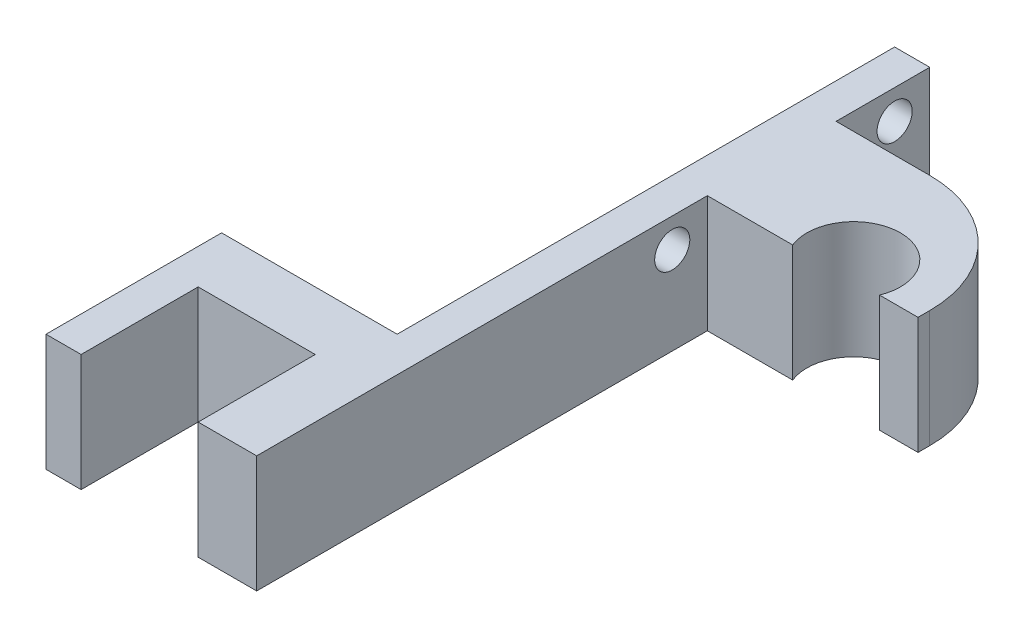
ISO-10303-21;
HEADER;
FILE_DESCRIPTION(('STEP AP214'),'2;1');
FILE_NAME('part.step','',(''),(''),'','','');
FILE_SCHEMA(('AUTOMOTIVE_DESIGN { 1 0 10303 214 1 1 1 1 }'));
ENDSEC;
DATA;
#1=APPLICATION_CONTEXT('core data for automotive mechanical design processes');
#2=APPLICATION_PROTOCOL_DEFINITION('international standard','automotive_design',2000,#1);
#3=PRODUCT_CONTEXT('',#1,'mechanical');
#4=PRODUCT('Part','Part','',(#3));
#5=PRODUCT_RELATED_PRODUCT_CATEGORY('part','',(#4));
#6=PRODUCT_DEFINITION_FORMATION('','',#4);
#7=PRODUCT_DEFINITION_CONTEXT('part definition',#1,'design');
#8=PRODUCT_DEFINITION('design','',#6,#7);
#9=PRODUCT_DEFINITION_SHAPE('','',#8);
#10=(LENGTH_UNIT() NAMED_UNIT(*) SI_UNIT(.MILLI.,.METRE.));
#11=(NAMED_UNIT(*) PLANE_ANGLE_UNIT() SI_UNIT($,.RADIAN.));
#12=(NAMED_UNIT(*) SI_UNIT($,.STERADIAN.) SOLID_ANGLE_UNIT());
#13=UNCERTAINTY_MEASURE_WITH_UNIT(LENGTH_MEASURE(1.E-05),#10,'distance_accuracy_value','');
#14=(GEOMETRIC_REPRESENTATION_CONTEXT(3) GLOBAL_UNCERTAINTY_ASSIGNED_CONTEXT((#13)) GLOBAL_UNIT_ASSIGNED_CONTEXT((#10,
#11,#12)) REPRESENTATION_CONTEXT('',''));
#15=CARTESIAN_POINT('',(0.,0.,0.));
#16=DIRECTION('',(0.,0.,1.));
#17=DIRECTION('',(1.,0.,0.));
#18=AXIS2_PLACEMENT_3D('',#15,#16,#17);
#19=CARTESIAN_POINT('',(5.,10.,-42.5));
#20=DIRECTION('',(0.,0.,1.));
#21=DIRECTION('',(1.,0.,0.));
#22=AXIS2_PLACEMENT_3D('',#19,#20,#21);
#23=PLANE('',#22);
#24=DIRECTION('',(0.,-1.,0.));
#25=VECTOR('',#24,1.);
#26=CARTESIAN_POINT('',(2.,10.,-42.5));
#27=LINE('',#26,#25);
#28=CARTESIAN_POINT('',(2.,10.,-42.5));
#29=VERTEX_POINT('',#28);
#30=CARTESIAN_POINT('',(2.,0.,-42.5));
#31=VERTEX_POINT('',#30);
#32=EDGE_CURVE('E178',#29,#31,#27,.T.);
#33=ORIENTED_EDGE('',*,*,#32,.F.);
#34=DIRECTION('',(-1.,0.,0.));
#35=VECTOR('',#34,1.);
#36=CARTESIAN_POINT('',(5.,10.,-42.5));
#37=LINE('',#36,#35);
#38=CARTESIAN_POINT('',(5.,10.,-42.5));
#39=VERTEX_POINT('',#38);
#40=EDGE_CURVE('E229',#39,#29,#37,.T.);
#41=ORIENTED_EDGE('',*,*,#40,.F.);
#42=DIRECTION('',(0.,-1.,0.));
#43=VECTOR('',#42,1.);
#44=CARTESIAN_POINT('',(5.,10.,-42.5));
#45=LINE('',#44,#43);
#46=CARTESIAN_POINT('',(5.,0.,-42.5));
#47=VERTEX_POINT('',#46);
#48=EDGE_CURVE('E231',#39,#47,#45,.T.);
#49=ORIENTED_EDGE('',*,*,#48,.T.);
#50=DIRECTION('',(-1.,0.,0.));
#51=VECTOR('',#50,1.);
#52=CARTESIAN_POINT('',(5.,0.,-42.5));
#53=LINE('',#52,#51);
#54=EDGE_CURVE('E205',#47,#31,#53,.T.);
#55=ORIENTED_EDGE('',*,*,#54,.T.);
#56=EDGE_LOOP('',(#33,#41,#49,#55));
#57=FACE_BOUND('',#56,.T.);
#58=ADVANCED_FACE('F34',(#57),#23,.F.);
#59=CARTESIAN_POINT('',(23.,7.5,-39.5));
#60=DIRECTION('',(-1.,0.,0.));
#61=DIRECTION('',(0.,0.,1.));
#62=AXIS2_PLACEMENT_3D('',#59,#60,#61);
#63=CYLINDRICAL_SURFACE('',#62,1.5);
#64=CARTESIAN_POINT('',(5.,7.5,-39.5));
#65=DIRECTION('',(-1.,0.,0.));
#66=DIRECTION('',(0.,0.,1.));
#67=AXIS2_PLACEMENT_3D('',#64,#65,#66);
#68=CIRCLE('',#67,1.5);
#69=CARTESIAN_POINT('',(5.,7.5,-38.));
#70=VERTEX_POINT('',#69);
#71=EDGE_CURVE('E190',#70,#70,#68,.T.);
#72=ORIENTED_EDGE('',*,*,#71,.F.);
#73=EDGE_LOOP('',(#72));
#74=FACE_BOUND('',#73,.T.);
#75=CARTESIAN_POINT('',(2.,7.5,-39.5));
#76=DIRECTION('',(-1.,0.,0.));
#77=DIRECTION('',(0.,0.,1.));
#78=AXIS2_PLACEMENT_3D('',#75,#76,#77);
#79=CIRCLE('',#78,1.5);
#80=CARTESIAN_POINT('',(2.,7.5,-38.));
#81=VERTEX_POINT('',#80);
#82=EDGE_CURVE('E184',#81,#81,#79,.F.);
#83=ORIENTED_EDGE('',*,*,#82,.F.);
#84=EDGE_LOOP('',(#83));
#85=FACE_BOUND('',#84,.T.);
#86=ADVANCED_FACE('F316',(#74,#85),#63,.F.);
#87=CARTESIAN_POINT('',(23.,7.5,-20.5));
#88=DIRECTION('',(-1.,0.,0.));
#89=DIRECTION('',(0.,0.,1.));
#90=AXIS2_PLACEMENT_3D('',#87,#88,#89);
#91=CYLINDRICAL_SURFACE('',#90,1.5);
#92=CARTESIAN_POINT('',(5.,7.5,-20.5));
#93=DIRECTION('',(-1.,0.,0.));
#94=DIRECTION('',(0.,0.,1.));
#95=AXIS2_PLACEMENT_3D('',#92,#93,#94);
#96=CIRCLE('',#95,1.5);
#97=CARTESIAN_POINT('',(5.,7.5,-19.));
#98=VERTEX_POINT('',#97);
#99=EDGE_CURVE('E187',#98,#98,#96,.T.);
#100=ORIENTED_EDGE('',*,*,#99,.F.);
#101=EDGE_LOOP('',(#100));
#102=FACE_BOUND('',#101,.T.);
#103=CARTESIAN_POINT('',(2.,7.5,-20.5));
#104=DIRECTION('',(-1.,0.,0.));
#105=DIRECTION('',(0.,0.,1.));
#106=AXIS2_PLACEMENT_3D('',#103,#104,#105);
#107=CIRCLE('',#106,1.5);
#108=CARTESIAN_POINT('',(2.,7.5,-19.));
#109=VERTEX_POINT('',#108);
#110=EDGE_CURVE('E183',#109,#109,#107,.F.);
#111=ORIENTED_EDGE('',*,*,#110,.F.);
#112=EDGE_LOOP('',(#111));
#113=FACE_BOUND('',#112,.T.);
#114=ADVANCED_FACE('F321',(#102,#113),#91,.F.);
#115=CARTESIAN_POINT('',(23.,10.,-23.5));
#116=DIRECTION('',(0.,0.,-1.));
#117=DIRECTION('',(-1.,0.,0.));
#118=AXIS2_PLACEMENT_3D('',#115,#116,#117);
#119=PLANE('',#118);
#120=DIRECTION('',(1.,0.,0.));
#121=VECTOR('',#120,1.);
#122=CARTESIAN_POINT('',(23.,0.,-23.5));
#123=LINE('',#122,#121);
#124=CARTESIAN_POINT('',(5.,0.,-23.5));
#125=VERTEX_POINT('',#124);
#126=CARTESIAN_POINT('',(12.2919007564522,0.,-23.5));
#127=VERTEX_POINT('',#126);
#128=EDGE_CURVE('E247',#125,#127,#123,.T.);
#129=ORIENTED_EDGE('',*,*,#128,.T.);
#130=DIRECTION('',(0.,1.,0.));
#131=VECTOR('',#130,1.);
#132=CARTESIAN_POINT('',(12.2919007564522,0.,-23.5));
#133=LINE('',#132,#131);
#134=CARTESIAN_POINT('',(12.2919007564522,10.,-23.5));
#135=VERTEX_POINT('',#134);
#136=EDGE_CURVE('E164',#127,#135,#133,.T.);
#137=ORIENTED_EDGE('',*,*,#136,.T.);
#138=DIRECTION('',(1.,0.,0.));
#139=VECTOR('',#138,1.);
#140=CARTESIAN_POINT('',(23.,10.,-23.5));
#141=LINE('',#140,#139);
#142=CARTESIAN_POINT('',(5.,10.,-23.5));
#143=VERTEX_POINT('',#142);
#144=EDGE_CURVE('E220',#143,#135,#141,.T.);
#145=ORIENTED_EDGE('',*,*,#144,.F.);
#146=DIRECTION('',(0.,-1.,0.));
#147=VECTOR('',#146,1.);
#148=CARTESIAN_POINT('',(5.,10.,-23.5));
#149=LINE('',#148,#147);
#150=EDGE_CURVE('E265',#143,#125,#149,.T.);
#151=ORIENTED_EDGE('',*,*,#150,.T.);
#152=EDGE_LOOP('',(#129,#137,#145,#151));
#153=FACE_BOUND('',#152,.T.);
#154=ADVANCED_FACE('F340',(#153),#119,.F.);
#155=CARTESIAN_POINT('',(-13.,10.,0.));
#156=DIRECTION('',(0.,0.,1.));
#157=DIRECTION('',(1.,0.,0.));
#158=AXIS2_PLACEMENT_3D('',#155,#156,#157);
#159=PLANE('',#158);
#160=DIRECTION('',(-1.,0.,0.));
#161=VECTOR('',#160,1.);
#162=CARTESIAN_POINT('',(-13.,0.,0.));
#163=LINE('',#162,#161);
#164=CARTESIAN_POINT('',(2.,0.,0.));
#165=VERTEX_POINT('',#164);
#166=CARTESIAN_POINT('',(-13.,0.,0.));
#167=VERTEX_POINT('',#166);
#168=EDGE_CURVE('E152',#165,#167,#163,.T.);
#169=ORIENTED_EDGE('',*,*,#168,.T.);
#170=DIRECTION('',(0.,-1.,0.));
#171=VECTOR('',#170,1.);
#172=CARTESIAN_POINT('',(-13.,10.,0.));
#173=LINE('',#172,#171);
#174=CARTESIAN_POINT('',(-13.,10.,0.));
#175=VERTEX_POINT('',#174);
#176=EDGE_CURVE('E286',#175,#167,#173,.T.);
#177=ORIENTED_EDGE('',*,*,#176,.F.);
#178=DIRECTION('',(-1.,0.,0.));
#179=VECTOR('',#178,1.);
#180=CARTESIAN_POINT('',(-13.,10.,0.));
#181=LINE('',#180,#179);
#182=CARTESIAN_POINT('',(2.,10.,0.));
#183=VERTEX_POINT('',#182);
#184=EDGE_CURVE('E170',#183,#175,#181,.T.);
#185=ORIENTED_EDGE('',*,*,#184,.F.);
#186=DIRECTION('',(0.,1.,0.));
#187=VECTOR('',#186,1.);
#188=CARTESIAN_POINT('',(2.,10.,0.));
#189=LINE('',#188,#187);
#190=EDGE_CURVE('E167',#165,#183,#189,.T.);
#191=ORIENTED_EDGE('',*,*,#190,.F.);
#192=EDGE_LOOP('',(#169,#177,#185,#191));
#193=FACE_BOUND('',#192,.T.);
#194=ADVANCED_FACE('F168',(#193),#159,.F.);
#195=CARTESIAN_POINT('',(-13.,10.,15.));
#196=DIRECTION('',(1.,0.,0.));
#197=DIRECTION('',(0.,0.,-1.));
#198=AXIS2_PLACEMENT_3D('',#195,#196,#197);
#199=PLANE('',#198);
#200=DIRECTION('',(0.,0.,1.));
#201=VECTOR('',#200,1.);
#202=CARTESIAN_POINT('',(-13.,0.,15.));
#203=LINE('',#202,#201);
#204=CARTESIAN_POINT('',(-13.,0.,15.));
#205=VERTEX_POINT('',#204);
#206=EDGE_CURVE('E160',#167,#205,#203,.T.);
#207=ORIENTED_EDGE('',*,*,#206,.T.);
#208=DIRECTION('',(0.,-1.,0.));
#209=VECTOR('',#208,1.);
#210=CARTESIAN_POINT('',(-13.,10.,15.));
#211=LINE('',#210,#209);
#212=CARTESIAN_POINT('',(-13.,10.,15.));
#213=VERTEX_POINT('',#212);
#214=EDGE_CURVE('E283',#213,#205,#211,.T.);
#215=ORIENTED_EDGE('',*,*,#214,.F.);
#216=DIRECTION('',(0.,0.,1.));
#217=VECTOR('',#216,1.);
#218=CARTESIAN_POINT('',(-13.,10.,15.));
#219=LINE('',#218,#217);
#220=EDGE_CURVE('E204',#175,#213,#219,.T.);
#221=ORIENTED_EDGE('',*,*,#220,.F.);
#222=ORIENTED_EDGE('',*,*,#176,.T.);
#223=EDGE_LOOP('',(#207,#215,#221,#222));
#224=FACE_BOUND('',#223,.T.);
#225=ADVANCED_FACE('F363',(#224),#199,.F.);
#226=CARTESIAN_POINT('',(-10.,10.,15.));
#227=DIRECTION('',(0.,0.,-1.));
#228=DIRECTION('',(-1.,0.,0.));
#229=AXIS2_PLACEMENT_3D('',#226,#227,#228);
#230=PLANE('',#229);
#231=DIRECTION('',(1.,0.,0.));
#232=VECTOR('',#231,1.);
#233=CARTESIAN_POINT('',(-10.,0.,15.));
#234=LINE('',#233,#232);
#235=CARTESIAN_POINT('',(-10.,0.,15.));
#236=VERTEX_POINT('',#235);
#237=EDGE_CURVE('E234',#205,#236,#234,.T.);
#238=ORIENTED_EDGE('',*,*,#237,.T.);
#239=DIRECTION('',(0.,-1.,0.));
#240=VECTOR('',#239,1.);
#241=CARTESIAN_POINT('',(-10.,10.,15.));
#242=LINE('',#241,#240);
#243=CARTESIAN_POINT('',(-10.,10.,15.));
#244=VERTEX_POINT('',#243);
#245=EDGE_CURVE('E280',#244,#236,#242,.T.);
#246=ORIENTED_EDGE('',*,*,#245,.F.);
#247=DIRECTION('',(1.,0.,0.));
#248=VECTOR('',#247,1.);
#249=CARTESIAN_POINT('',(-10.,10.,15.));
#250=LINE('',#249,#248);
#251=EDGE_CURVE('E207',#213,#244,#250,.T.);
#252=ORIENTED_EDGE('',*,*,#251,.F.);
#253=ORIENTED_EDGE('',*,*,#214,.T.);
#254=EDGE_LOOP('',(#238,#246,#252,#253));
#255=FACE_BOUND('',#254,.T.);
#256=ADVANCED_FACE('F359',(#255),#230,.F.);
#257=CARTESIAN_POINT('',(-10.,10.,5.));
#258=DIRECTION('',(-1.,0.,0.));
#259=DIRECTION('',(0.,0.,1.));
#260=AXIS2_PLACEMENT_3D('',#257,#258,#259);
#261=PLANE('',#260);
#262=DIRECTION('',(0.,0.,-1.));
#263=VECTOR('',#262,1.);
#264=CARTESIAN_POINT('',(-10.,0.,5.));
#265=LINE('',#264,#263);
#266=CARTESIAN_POINT('',(-10.,0.,5.));
#267=VERTEX_POINT('',#266);
#268=EDGE_CURVE('E236',#236,#267,#265,.T.);
#269=ORIENTED_EDGE('',*,*,#268,.T.);
#270=DIRECTION('',(0.,-1.,0.));
#271=VECTOR('',#270,1.);
#272=CARTESIAN_POINT('',(-10.,10.,5.));
#273=LINE('',#272,#271);
#274=CARTESIAN_POINT('',(-10.,10.,5.));
#275=VERTEX_POINT('',#274);
#276=EDGE_CURVE('E277',#275,#267,#273,.T.);
#277=ORIENTED_EDGE('',*,*,#276,.F.);
#278=DIRECTION('',(0.,0.,-1.));
#279=VECTOR('',#278,1.);
#280=CARTESIAN_POINT('',(-10.,10.,5.));
#281=LINE('',#280,#279);
#282=EDGE_CURVE('E209',#244,#275,#281,.T.);
#283=ORIENTED_EDGE('',*,*,#282,.F.);
#284=ORIENTED_EDGE('',*,*,#245,.T.);
#285=EDGE_LOOP('',(#269,#277,#283,#284));
#286=FACE_BOUND('',#285,.T.);
#287=ADVANCED_FACE('F355',(#286),#261,.F.);
#288=CARTESIAN_POINT('',(0.,10.,5.));
#289=DIRECTION('',(0.,0.,-1.));
#290=DIRECTION('',(-1.,0.,0.));
#291=AXIS2_PLACEMENT_3D('',#288,#289,#290);
#292=PLANE('',#291);
#293=DIRECTION('',(1.,0.,0.));
#294=VECTOR('',#293,1.);
#295=CARTESIAN_POINT('',(0.,0.,5.));
#296=LINE('',#295,#294);
#297=CARTESIAN_POINT('',(0.,0.,5.));
#298=VERTEX_POINT('',#297);
#299=EDGE_CURVE('E238',#267,#298,#296,.T.);
#300=ORIENTED_EDGE('',*,*,#299,.T.);
#301=DIRECTION('',(0.,-1.,0.));
#302=VECTOR('',#301,1.);
#303=CARTESIAN_POINT('',(0.,10.,5.));
#304=LINE('',#303,#302);
#305=CARTESIAN_POINT('',(0.,10.,5.));
#306=VERTEX_POINT('',#305);
#307=EDGE_CURVE('E274',#306,#298,#304,.T.);
#308=ORIENTED_EDGE('',*,*,#307,.F.);
#309=DIRECTION('',(1.,0.,0.));
#310=VECTOR('',#309,1.);
#311=CARTESIAN_POINT('',(0.,10.,5.));
#312=LINE('',#311,#310);
#313=EDGE_CURVE('E211',#275,#306,#312,.T.);
#314=ORIENTED_EDGE('',*,*,#313,.F.);
#315=ORIENTED_EDGE('',*,*,#276,.T.);
#316=EDGE_LOOP('',(#300,#308,#314,#315));
#317=FACE_BOUND('',#316,.T.);
#318=ADVANCED_FACE('F351',(#317),#292,.F.);
#319=CARTESIAN_POINT('',(0.,10.,15.));
#320=DIRECTION('',(1.,0.,0.));
#321=DIRECTION('',(0.,0.,-1.));
#322=AXIS2_PLACEMENT_3D('',#319,#320,#321);
#323=PLANE('',#322);
#324=DIRECTION('',(0.,0.,1.));
#325=VECTOR('',#324,1.);
#326=CARTESIAN_POINT('',(0.,0.,15.));
#327=LINE('',#326,#325);
#328=CARTESIAN_POINT('',(0.,0.,15.));
#329=VERTEX_POINT('',#328);
#330=EDGE_CURVE('E240',#298,#329,#327,.T.);
#331=ORIENTED_EDGE('',*,*,#330,.T.);
#332=DIRECTION('',(0.,-1.,0.));
#333=VECTOR('',#332,1.);
#334=CARTESIAN_POINT('',(0.,10.,15.));
#335=LINE('',#334,#333);
#336=CARTESIAN_POINT('',(0.,10.,15.));
#337=VERTEX_POINT('',#336);
#338=EDGE_CURVE('E271',#337,#329,#335,.T.);
#339=ORIENTED_EDGE('',*,*,#338,.F.);
#340=DIRECTION('',(0.,0.,1.));
#341=VECTOR('',#340,1.);
#342=CARTESIAN_POINT('',(0.,10.,15.));
#343=LINE('',#342,#341);
#344=EDGE_CURVE('E213',#306,#337,#343,.T.);
#345=ORIENTED_EDGE('',*,*,#344,.F.);
#346=ORIENTED_EDGE('',*,*,#307,.T.);
#347=EDGE_LOOP('',(#331,#339,#345,#346));
#348=FACE_BOUND('',#347,.T.);
#349=ADVANCED_FACE('F347',(#348),#323,.F.);
#350=CARTESIAN_POINT('',(5.,10.,15.));
#351=DIRECTION('',(0.,0.,-1.));
#352=DIRECTION('',(-1.,0.,0.));
#353=AXIS2_PLACEMENT_3D('',#350,#351,#352);
#354=PLANE('',#353);
#355=DIRECTION('',(1.,0.,0.));
#356=VECTOR('',#355,1.);
#357=CARTESIAN_POINT('',(5.,0.,15.));
#358=LINE('',#357,#356);
#359=CARTESIAN_POINT('',(5.,0.,15.));
#360=VERTEX_POINT('',#359);
#361=EDGE_CURVE('E242',#329,#360,#358,.T.);
#362=ORIENTED_EDGE('',*,*,#361,.T.);
#363=DIRECTION('',(0.,-1.,0.));
#364=VECTOR('',#363,1.);
#365=CARTESIAN_POINT('',(5.,10.,15.));
#366=LINE('',#365,#364);
#367=CARTESIAN_POINT('',(5.,10.,15.));
#368=VERTEX_POINT('',#367);
#369=EDGE_CURVE('E268',#368,#360,#366,.T.);
#370=ORIENTED_EDGE('',*,*,#369,.F.);
#371=DIRECTION('',(1.,0.,0.));
#372=VECTOR('',#371,1.);
#373=CARTESIAN_POINT('',(5.,10.,15.));
#374=LINE('',#373,#372);
#375=EDGE_CURVE('E215',#337,#368,#374,.T.);
#376=ORIENTED_EDGE('',*,*,#375,.F.);
#377=ORIENTED_EDGE('',*,*,#338,.T.);
#378=EDGE_LOOP('',(#362,#370,#376,#377));
#379=FACE_BOUND('',#378,.T.);
#380=ADVANCED_FACE('F343',(#379),#354,.F.);
#381=CARTESIAN_POINT('',(5.,10.,-23.5));
#382=DIRECTION('',(-1.,0.,0.));
#383=DIRECTION('',(0.,0.,1.));
#384=AXIS2_PLACEMENT_3D('',#381,#382,#383);
#385=PLANE('',#384);
#386=ORIENTED_EDGE('',*,*,#99,.T.);
#387=EDGE_LOOP('',(#386));
#388=FACE_BOUND('',#387,.T.);
#389=DIRECTION('',(0.,0.,-1.));
#390=VECTOR('',#389,1.);
#391=CARTESIAN_POINT('',(5.,0.,-23.5));
#392=LINE('',#391,#390);
#393=EDGE_CURVE('E244',#360,#125,#392,.T.);
#394=ORIENTED_EDGE('',*,*,#393,.T.);
#395=ORIENTED_EDGE('',*,*,#150,.F.);
#396=DIRECTION('',(0.,0.,-1.));
#397=VECTOR('',#396,1.);
#398=CARTESIAN_POINT('',(5.,10.,-23.5));
#399=LINE('',#398,#397);
#400=EDGE_CURVE('E217',#368,#143,#399,.T.);
#401=ORIENTED_EDGE('',*,*,#400,.F.);
#402=ORIENTED_EDGE('',*,*,#369,.T.);
#403=EDGE_LOOP('',(#394,#395,#401,#402));
#404=FACE_BOUND('',#403,.T.);
#405=ADVANCED_FACE('F338',(#388,#404),#385,.F.);
#406=CARTESIAN_POINT('',(19.7080992435478,10.,-23.5));
#407=VERTEX_POINT('',#406);
#408=CARTESIAN_POINT('',(23.,10.,-23.5));
#409=VERTEX_POINT('',#408);
#410=EDGE_CURVE('E219',#407,#409,#141,.T.);
#411=ORIENTED_EDGE('',*,*,#410,.F.);
#412=DIRECTION('',(0.,1.,0.));
#413=VECTOR('',#412,1.);
#414=CARTESIAN_POINT('',(19.7080992435478,0.,-23.5));
#415=LINE('',#414,#413);
#416=CARTESIAN_POINT('',(19.7080992435478,0.,-23.5));
#417=VERTEX_POINT('',#416);
#418=EDGE_CURVE('E197',#407,#417,#415,.F.);
#419=ORIENTED_EDGE('',*,*,#418,.T.);
#420=CARTESIAN_POINT('',(23.,0.,-23.5));
#421=VERTEX_POINT('',#420);
#422=EDGE_CURVE('E246',#417,#421,#123,.T.);
#423=ORIENTED_EDGE('',*,*,#422,.T.);
#424=DIRECTION('',(0.,-1.,0.));
#425=VECTOR('',#424,1.);
#426=CARTESIAN_POINT('',(23.,10.,-23.5));
#427=LINE('',#426,#425);
#428=EDGE_CURVE('E262',#409,#421,#427,.T.);
#429=ORIENTED_EDGE('',*,*,#428,.F.);
#430=EDGE_LOOP('',(#411,#419,#423,#429));
#431=FACE_BOUND('',#430,.T.);
#432=ADVANCED_FACE('F335',(#431),#119,.F.);
#433=CARTESIAN_POINT('',(23.,10.,-23.5));
#434=DIRECTION('',(-1.,0.,0.));
#435=DIRECTION('',(0.,0.,1.));
#436=AXIS2_PLACEMENT_3D('',#433,#434,#435);
#437=PLANE('',#436);
#438=DIRECTION('',(0.,0.,-1.));
#439=VECTOR('',#438,1.);
#440=CARTESIAN_POINT('',(23.,0.,-23.5));
#441=LINE('',#440,#439);
#442=CARTESIAN_POINT('',(23.,0.,-24.5));
#443=VERTEX_POINT('',#442);
#444=EDGE_CURVE('E250',#421,#443,#441,.T.);
#445=ORIENTED_EDGE('',*,*,#444,.T.);
#446=DIRECTION('',(0.,-1.,0.));
#447=VECTOR('',#446,1.);
#448=CARTESIAN_POINT('',(23.,10.,-24.5));
#449=LINE('',#448,#447);
#450=CARTESIAN_POINT('',(23.,10.,-24.5));
#451=VERTEX_POINT('',#450);
#452=EDGE_CURVE('E42',#443,#451,#449,.F.);
#453=ORIENTED_EDGE('',*,*,#452,.T.);
#454=DIRECTION('',(0.,0.,-1.));
#455=VECTOR('',#454,1.);
#456=CARTESIAN_POINT('',(23.,10.,-23.5));
#457=LINE('',#456,#455);
#458=EDGE_CURVE('E223',#409,#451,#457,.T.);
#459=ORIENTED_EDGE('',*,*,#458,.F.);
#460=ORIENTED_EDGE('',*,*,#428,.T.);
#461=EDGE_LOOP('',(#445,#453,#459,#460));
#462=FACE_BOUND('',#461,.T.);
#463=ADVANCED_FACE('F332',(#462),#437,.F.);
#464=CARTESIAN_POINT('',(5.,10.,-34.5));
#465=DIRECTION('',(0.,0.,1.));
#466=DIRECTION('',(1.,0.,0.));
#467=AXIS2_PLACEMENT_3D('',#464,#465,#466);
#468=PLANE('',#467);
#469=DIRECTION('',(-1.,0.,0.));
#470=VECTOR('',#469,1.);
#471=CARTESIAN_POINT('',(5.,10.,-34.5));
#472=LINE('',#471,#470);
#473=CARTESIAN_POINT('',(13.,10.,-34.5));
#474=VERTEX_POINT('',#473);
#475=CARTESIAN_POINT('',(5.,10.,-34.5));
#476=VERTEX_POINT('',#475);
#477=EDGE_CURVE('E225',#474,#476,#472,.T.);
#478=ORIENTED_EDGE('',*,*,#477,.F.);
#479=DIRECTION('',(0.,-1.,0.));
#480=VECTOR('',#479,1.);
#481=CARTESIAN_POINT('',(13.,10.,-34.5));
#482=LINE('',#481,#480);
#483=CARTESIAN_POINT('',(13.,0.,-34.5));
#484=VERTEX_POINT('',#483);
#485=EDGE_CURVE('E288',#474,#484,#482,.T.);
#486=ORIENTED_EDGE('',*,*,#485,.T.);
#487=DIRECTION('',(-1.,0.,0.));
#488=VECTOR('',#487,1.);
#489=CARTESIAN_POINT('',(5.,0.,-34.5));
#490=LINE('',#489,#488);
#491=CARTESIAN_POINT('',(5.,0.,-34.5));
#492=VERTEX_POINT('',#491);
#493=EDGE_CURVE('E252',#484,#492,#490,.T.);
#494=ORIENTED_EDGE('',*,*,#493,.T.);
#495=DIRECTION('',(0.,-1.,0.));
#496=VECTOR('',#495,1.);
#497=CARTESIAN_POINT('',(5.,10.,-34.5));
#498=LINE('',#497,#496);
#499=EDGE_CURVE('E259',#476,#492,#498,.T.);
#500=ORIENTED_EDGE('',*,*,#499,.F.);
#501=EDGE_LOOP('',(#478,#486,#494,#500));
#502=FACE_BOUND('',#501,.T.);
#503=ADVANCED_FACE('F296',(#502),#468,.F.);
#504=CARTESIAN_POINT('',(5.,10.,-34.5));
#505=DIRECTION('',(-1.,0.,0.));
#506=DIRECTION('',(0.,0.,1.));
#507=AXIS2_PLACEMENT_3D('',#504,#505,#506);
#508=PLANE('',#507);
#509=ORIENTED_EDGE('',*,*,#71,.T.);
#510=EDGE_LOOP('',(#509));
#511=FACE_BOUND('',#510,.T.);
#512=DIRECTION('',(0.,0.,-1.));
#513=VECTOR('',#512,1.);
#514=CARTESIAN_POINT('',(5.,0.,-34.5));
#515=LINE('',#514,#513);
#516=EDGE_CURVE('E254',#492,#47,#515,.T.);
#517=ORIENTED_EDGE('',*,*,#516,.T.);
#518=ORIENTED_EDGE('',*,*,#48,.F.);
#519=DIRECTION('',(0.,0.,-1.));
#520=VECTOR('',#519,1.);
#521=CARTESIAN_POINT('',(5.,10.,-34.5));
#522=LINE('',#521,#520);
#523=EDGE_CURVE('E227',#476,#39,#522,.T.);
#524=ORIENTED_EDGE('',*,*,#523,.F.);
#525=ORIENTED_EDGE('',*,*,#499,.T.);
#526=EDGE_LOOP('',(#517,#518,#524,#525));
#527=FACE_BOUND('',#526,.T.);
#528=ADVANCED_FACE('F303',(#511,#527),#508,.F.);
#529=CARTESIAN_POINT('',(0.,10.,0.));
#530=DIRECTION('',(0.,1.,0.));
#531=DIRECTION('',(0.,0.,1.));
#532=AXIS2_PLACEMENT_3D('',#529,#530,#531);
#533=PLANE('',#532);
#534=ORIENTED_EDGE('',*,*,#458,.T.);
#535=CARTESIAN_POINT('',(13.,10.,-24.5));
#536=DIRECTION('',(0.,1.,0.));
#537=DIRECTION('',(0.,0.,1.));
#538=AXIS2_PLACEMENT_3D('',#535,#536,#537);
#539=CIRCLE('',#538,10.);
#540=EDGE_CURVE('E12',#451,#474,#539,.T.);
#541=ORIENTED_EDGE('',*,*,#540,.T.);
#542=ORIENTED_EDGE('',*,*,#477,.T.);
#543=ORIENTED_EDGE('',*,*,#523,.T.);
#544=ORIENTED_EDGE('',*,*,#40,.T.);
#545=DIRECTION('',(0.,0.,-1.));
#546=VECTOR('',#545,1.);
#547=CARTESIAN_POINT('',(2.,10.,-42.5));
#548=LINE('',#547,#546);
#549=EDGE_CURVE('E173',#183,#29,#548,.T.);
#550=ORIENTED_EDGE('',*,*,#549,.F.);
#551=ORIENTED_EDGE('',*,*,#184,.T.);
#552=ORIENTED_EDGE('',*,*,#220,.T.);
#553=ORIENTED_EDGE('',*,*,#251,.T.);
#554=ORIENTED_EDGE('',*,*,#282,.T.);
#555=ORIENTED_EDGE('',*,*,#313,.T.);
#556=ORIENTED_EDGE('',*,*,#344,.T.);
#557=ORIENTED_EDGE('',*,*,#375,.T.);
#558=ORIENTED_EDGE('',*,*,#400,.T.);
#559=ORIENTED_EDGE('',*,*,#144,.T.);
#560=CARTESIAN_POINT('',(16.,10.,-25.));
#561=DIRECTION('',(0.,1.,0.));
#562=DIRECTION('',(0.,0.,1.));
#563=AXIS2_PLACEMENT_3D('',#560,#561,#562);
#564=CIRCLE('',#563,4.);
#565=EDGE_CURVE('E193',#407,#135,#564,.T.);
#566=ORIENTED_EDGE('',*,*,#565,.F.);
#567=ORIENTED_EDGE('',*,*,#410,.T.);
#568=EDGE_LOOP('',(#534,#541,#542,#543,#544,#550,#551,#552,#553,#554,#555,#556,#557,#558,#559,
#566,#567));
#569=FACE_BOUND('',#568,.T.);
#570=ADVANCED_FACE('F308',(#569),#533,.T.);
#571=CARTESIAN_POINT('',(0.,0.,0.));
#572=DIRECTION('',(0.,1.,0.));
#573=DIRECTION('',(0.,0.,1.));
#574=AXIS2_PLACEMENT_3D('',#571,#572,#573);
#575=PLANE('',#574);
#576=ORIENTED_EDGE('',*,*,#493,.F.);
#577=CARTESIAN_POINT('',(13.,0.,-24.5));
#578=DIRECTION('',(0.,1.,0.));
#579=DIRECTION('',(0.,0.,1.));
#580=AXIS2_PLACEMENT_3D('',#577,#578,#579);
#581=CIRCLE('',#580,10.);
#582=EDGE_CURVE('E56',#484,#443,#581,.F.);
#583=ORIENTED_EDGE('',*,*,#582,.T.);
#584=ORIENTED_EDGE('',*,*,#444,.F.);
#585=ORIENTED_EDGE('',*,*,#422,.F.);
#586=CARTESIAN_POINT('',(16.,0.,-25.));
#587=DIRECTION('',(0.,1.,0.));
#588=DIRECTION('',(0.,0.,1.));
#589=AXIS2_PLACEMENT_3D('',#586,#587,#588);
#590=CIRCLE('',#589,4.);
#591=EDGE_CURVE('E194',#417,#127,#590,.T.);
#592=ORIENTED_EDGE('',*,*,#591,.T.);
#593=ORIENTED_EDGE('',*,*,#128,.F.);
#594=ORIENTED_EDGE('',*,*,#393,.F.);
#595=ORIENTED_EDGE('',*,*,#361,.F.);
#596=ORIENTED_EDGE('',*,*,#330,.F.);
#597=ORIENTED_EDGE('',*,*,#299,.F.);
#598=ORIENTED_EDGE('',*,*,#268,.F.);
#599=ORIENTED_EDGE('',*,*,#237,.F.);
#600=ORIENTED_EDGE('',*,*,#206,.F.);
#601=ORIENTED_EDGE('',*,*,#168,.F.);
#602=DIRECTION('',(0.,0.,1.));
#603=VECTOR('',#602,1.);
#604=CARTESIAN_POINT('',(2.,0.,-42.5));
#605=LINE('',#604,#603);
#606=EDGE_CURVE('E157',#31,#165,#605,.T.);
#607=ORIENTED_EDGE('',*,*,#606,.F.);
#608=ORIENTED_EDGE('',*,*,#54,.F.);
#609=ORIENTED_EDGE('',*,*,#516,.F.);
#610=EDGE_LOOP('',(#576,#583,#584,#585,#592,#593,#594,#595,#596,#597,#598,#599,#600,#601,#607,
#608,#609));
#611=FACE_BOUND('',#610,.T.);
#612=ADVANCED_FACE('F154',(#611),#575,.F.);
#613=CARTESIAN_POINT('',(16.,0.,-25.));
#614=DIRECTION('',(0.,1.,0.));
#615=DIRECTION('',(0.,0.,1.));
#616=AXIS2_PLACEMENT_3D('',#613,#614,#615);
#617=CYLINDRICAL_SURFACE('',#616,4.);
#618=ORIENTED_EDGE('',*,*,#591,.F.);
#619=ORIENTED_EDGE('',*,*,#418,.F.);
#620=ORIENTED_EDGE('',*,*,#565,.T.);
#621=ORIENTED_EDGE('',*,*,#136,.F.);
#622=EDGE_LOOP('',(#618,#619,#620,#621));
#623=FACE_BOUND('',#622,.T.);
#624=ADVANCED_FACE('F313',(#623),#617,.F.);
#625=CARTESIAN_POINT('',(2.,0.,0.));
#626=DIRECTION('',(-1.,0.,0.));
#627=DIRECTION('',(0.,0.,1.));
#628=AXIS2_PLACEMENT_3D('',#625,#626,#627);
#629=PLANE('',#628);
#630=ORIENTED_EDGE('',*,*,#32,.T.);
#631=ORIENTED_EDGE('',*,*,#606,.T.);
#632=ORIENTED_EDGE('',*,*,#190,.T.);
#633=ORIENTED_EDGE('',*,*,#549,.T.);
#634=EDGE_LOOP('',(#630,#631,#632,#633));
#635=FACE_BOUND('',#634,.T.);
#636=ORIENTED_EDGE('',*,*,#110,.T.);
#637=EDGE_LOOP('',(#636));
#638=FACE_BOUND('',#637,.T.);
#639=ORIENTED_EDGE('',*,*,#82,.T.);
#640=EDGE_LOOP('',(#639));
#641=FACE_BOUND('',#640,.T.);
#642=ADVANCED_FACE('F175',(#635,#638,#641),#629,.T.);
#643=CARTESIAN_POINT('',(13.,10.,-24.5));
#644=DIRECTION('',(0.,-1.,0.));
#645=DIRECTION('',(0.,0.,-1.));
#646=AXIS2_PLACEMENT_3D('',#643,#644,#645);
#647=CYLINDRICAL_SURFACE('',#646,10.);
#648=ORIENTED_EDGE('',*,*,#540,.F.);
#649=ORIENTED_EDGE('',*,*,#452,.F.);
#650=ORIENTED_EDGE('',*,*,#582,.F.);
#651=ORIENTED_EDGE('',*,*,#485,.F.);
#652=EDGE_LOOP('',(#648,#649,#650,#651));
#653=FACE_BOUND('',#652,.T.);
#654=ADVANCED_FACE('F36',(#653),#647,.T.);
#655=CLOSED_SHELL('',(#58,#86,#114,#154,#194,#225,#256,#287,#318,#349,#380,#405,#432,#463,#503,
#528,#570,#612,#624,#642,#654));
#656=MANIFOLD_SOLID_BREP('B2',#655);
#657=ADVANCED_BREP_SHAPE_REPRESENTATION('',(#18,#656),#14);
#658=SHAPE_DEFINITION_REPRESENTATION(#9,#657);
ENDSEC;
END-ISO-10303-21;
